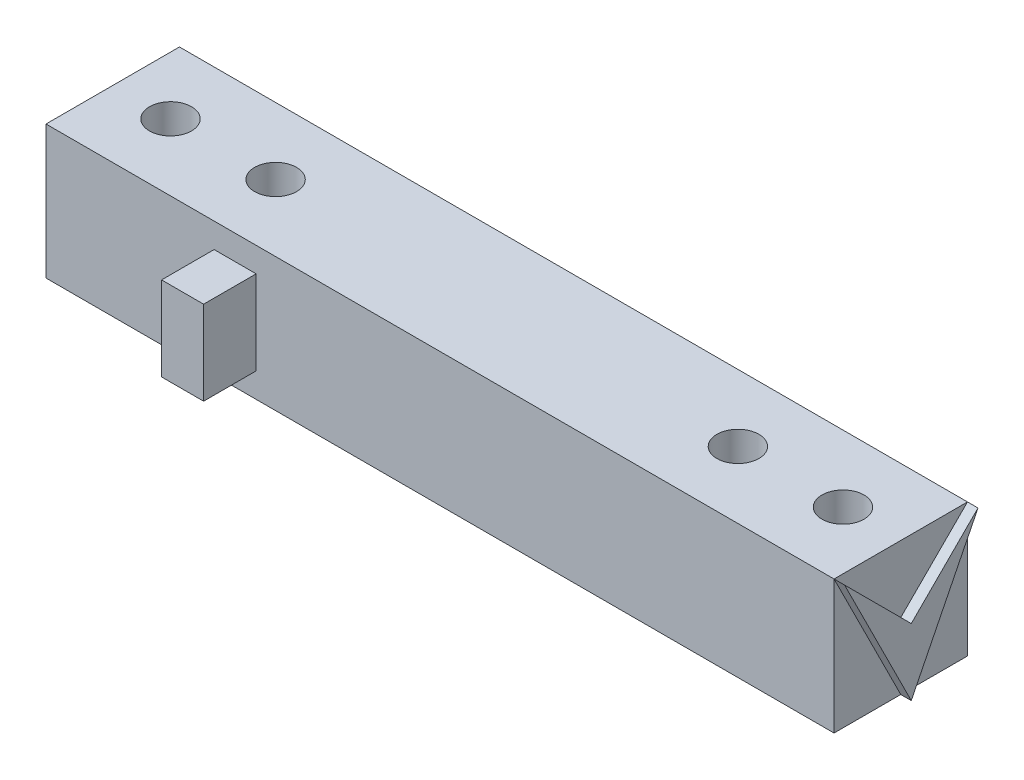
ISO-10303-21;
HEADER;
FILE_DESCRIPTION(('STEP AP214'),'2;1');
FILE_NAME('part.step','',(''),(''),'','','');
FILE_SCHEMA(('AUTOMOTIVE_DESIGN { 1 0 10303 214 1 1 1 1 }'));
ENDSEC;
DATA;
#1=APPLICATION_CONTEXT('core data for automotive mechanical design processes');
#2=APPLICATION_PROTOCOL_DEFINITION('international standard','automotive_design',2000,#1);
#3=PRODUCT_CONTEXT('',#1,'mechanical');
#4=PRODUCT('Part','Part','',(#3));
#5=PRODUCT_RELATED_PRODUCT_CATEGORY('part','',(#4));
#6=PRODUCT_DEFINITION_FORMATION('','',#4);
#7=PRODUCT_DEFINITION_CONTEXT('part definition',#1,'design');
#8=PRODUCT_DEFINITION('design','',#6,#7);
#9=PRODUCT_DEFINITION_SHAPE('','',#8);
#10=(LENGTH_UNIT() NAMED_UNIT(*) SI_UNIT(.MILLI.,.METRE.));
#11=(NAMED_UNIT(*) PLANE_ANGLE_UNIT() SI_UNIT($,.RADIAN.));
#12=(NAMED_UNIT(*) SI_UNIT($,.STERADIAN.) SOLID_ANGLE_UNIT());
#13=UNCERTAINTY_MEASURE_WITH_UNIT(LENGTH_MEASURE(1.E-05),#10,'distance_accuracy_value','');
#14=(GEOMETRIC_REPRESENTATION_CONTEXT(3) GLOBAL_UNCERTAINTY_ASSIGNED_CONTEXT((#13)) GLOBAL_UNIT_ASSIGNED_CONTEXT((#10,
#11,#12)) REPRESENTATION_CONTEXT('',''));
#15=CARTESIAN_POINT('',(0.,0.,0.));
#16=DIRECTION('',(0.,0.,1.));
#17=DIRECTION('',(1.,0.,0.));
#18=AXIS2_PLACEMENT_3D('',#15,#16,#17);
#19=CARTESIAN_POINT('',(75.,12.7,0.));
#20=DIRECTION('',(-1.,0.,0.));
#21=DIRECTION('',(0.,0.,1.));
#22=AXIS2_PLACEMENT_3D('',#19,#20,#21);
#23=PLANE('',#22);
#24=DIRECTION('',(0.,-0.894427190999916,-0.447213595499958));
#25=VECTOR('',#24,1.);
#26=CARTESIAN_POINT('',(75.,12.7,0.));
#27=LINE('',#26,#25);
#28=CARTESIAN_POINT('',(75.,12.7,0.));
#29=VERTEX_POINT('',#28);
#30=CARTESIAN_POINT('',(75.,0.,-6.35));
#31=VERTEX_POINT('',#30);
#32=EDGE_CURVE('E153',#29,#31,#27,.T.);
#33=ORIENTED_EDGE('',*,*,#32,.F.);
#34=DIRECTION('',(0.,-1.,0.));
#35=VECTOR('',#34,1.);
#36=CARTESIAN_POINT('',(75.,12.7,0.));
#37=LINE('',#36,#35);
#38=CARTESIAN_POINT('',(75.,0.,0.));
#39=VERTEX_POINT('',#38);
#40=EDGE_CURVE('E52',#29,#39,#37,.T.);
#41=ORIENTED_EDGE('',*,*,#40,.T.);
#42=DIRECTION('',(0.,0.,-1.));
#43=VECTOR('',#42,1.);
#44=CARTESIAN_POINT('',(75.,0.,0.));
#45=LINE('',#44,#43);
#46=EDGE_CURVE('E230',#39,#31,#45,.T.);
#47=ORIENTED_EDGE('',*,*,#46,.T.);
#48=EDGE_LOOP('',(#33,#41,#47));
#49=FACE_BOUND('',#48,.T.);
#50=ADVANCED_FACE('F43',(#49),#23,.F.);
#51=DIRECTION('',(0.,0.707106781186547,0.707106781186547));
#52=VECTOR('',#51,1.);
#53=CARTESIAN_POINT('',(75.,6.35,-6.35));
#54=LINE('',#53,#52);
#55=CARTESIAN_POINT('',(75.,6.35,-6.35));
#56=VERTEX_POINT('',#55);
#57=EDGE_CURVE('E60',#56,#29,#54,.T.);
#58=ORIENTED_EDGE('',*,*,#57,.F.);
#59=DIRECTION('',(0.,-0.707106781186547,0.707106781186547));
#60=VECTOR('',#59,1.);
#61=CARTESIAN_POINT('',(75.,12.7,-12.7));
#62=LINE('',#61,#60);
#63=CARTESIAN_POINT('',(75.,12.7,-12.7));
#64=VERTEX_POINT('',#63);
#65=EDGE_CURVE('E267',#64,#56,#62,.T.);
#66=ORIENTED_EDGE('',*,*,#65,.F.);
#67=DIRECTION('',(0.,0.,-1.));
#68=VECTOR('',#67,1.);
#69=CARTESIAN_POINT('',(75.,12.7,0.));
#70=LINE('',#69,#68);
#71=EDGE_CURVE('E219',#29,#64,#70,.T.);
#72=ORIENTED_EDGE('',*,*,#71,.F.);
#73=EDGE_LOOP('',(#58,#66,#72));
#74=FACE_BOUND('',#73,.T.);
#75=ADVANCED_FACE('F268',(#74),#23,.F.);
#76=DIRECTION('',(0.,0.894427190999916,-0.447213595499958));
#77=VECTOR('',#76,1.);
#78=CARTESIAN_POINT('',(75.,0.,-6.35));
#79=LINE('',#78,#77);
#80=EDGE_CURVE('E68',#31,#64,#79,.T.);
#81=ORIENTED_EDGE('',*,*,#80,.F.);
#82=CARTESIAN_POINT('',(75.,0.,-12.7));
#83=VERTEX_POINT('',#82);
#84=EDGE_CURVE('E229',#31,#83,#45,.T.);
#85=ORIENTED_EDGE('',*,*,#84,.T.);
#86=DIRECTION('',(0.,-1.,0.));
#87=VECTOR('',#86,1.);
#88=CARTESIAN_POINT('',(75.,12.7,-12.7));
#89=LINE('',#88,#87);
#90=EDGE_CURVE('E236',#64,#83,#89,.T.);
#91=ORIENTED_EDGE('',*,*,#90,.F.);
#92=EDGE_LOOP('',(#81,#85,#91));
#93=FACE_BOUND('',#92,.T.);
#94=ADVANCED_FACE('F264',(#93),#23,.F.);
#95=CARTESIAN_POINT('',(0.,12.7,0.));
#96=DIRECTION('',(0.,0.,-1.));
#97=DIRECTION('',(-1.,0.,0.));
#98=AXIS2_PLACEMENT_3D('',#95,#96,#97);
#99=PLANE('',#98);
#100=DIRECTION('',(1.,0.,0.));
#101=VECTOR('',#100,1.);
#102=CARTESIAN_POINT('',(0.,0.,0.));
#103=LINE('',#102,#101);
#104=CARTESIAN_POINT('',(0.,0.,0.));
#105=VERTEX_POINT('',#104);
#106=EDGE_CURVE('E227',#105,#39,#103,.T.);
#107=ORIENTED_EDGE('',*,*,#106,.T.);
#108=ORIENTED_EDGE('',*,*,#40,.F.);
#109=DIRECTION('',(1.,0.,0.));
#110=VECTOR('',#109,1.);
#111=CARTESIAN_POINT('',(0.,12.7,0.));
#112=LINE('',#111,#110);
#113=CARTESIAN_POINT('',(0.,12.7,0.));
#114=VERTEX_POINT('',#113);
#115=EDGE_CURVE('E215',#114,#29,#112,.T.);
#116=ORIENTED_EDGE('',*,*,#115,.F.);
#117=DIRECTION('',(0.,-1.,0.));
#118=VECTOR('',#117,1.);
#119=CARTESIAN_POINT('',(0.,12.7,0.));
#120=LINE('',#119,#118);
#121=EDGE_CURVE('E11',#114,#105,#120,.T.);
#122=ORIENTED_EDGE('',*,*,#121,.T.);
#123=EDGE_LOOP('',(#107,#108,#116,#122));
#124=FACE_BOUND('',#123,.T.);
#125=DIRECTION('',(0.,-1.,0.));
#126=VECTOR('',#125,1.);
#127=CARTESIAN_POINT('',(16.,2.35,0.));
#128=LINE('',#127,#126);
#129=CARTESIAN_POINT('',(16.,10.35,0.));
#130=VERTEX_POINT('',#129);
#131=CARTESIAN_POINT('',(16.,2.35,0.));
#132=VERTEX_POINT('',#131);
#133=EDGE_CURVE('E154',#130,#132,#128,.T.);
#134=ORIENTED_EDGE('',*,*,#133,.F.);
#135=DIRECTION('',(-1.,0.,0.));
#136=VECTOR('',#135,1.);
#137=CARTESIAN_POINT('',(20.,10.35,0.));
#138=LINE('',#137,#136);
#139=CARTESIAN_POINT('',(20.,10.35,0.));
#140=VERTEX_POINT('',#139);
#141=EDGE_CURVE('E167',#140,#130,#138,.T.);
#142=ORIENTED_EDGE('',*,*,#141,.F.);
#143=DIRECTION('',(0.,1.,0.));
#144=VECTOR('',#143,1.);
#145=CARTESIAN_POINT('',(20.,2.35,0.));
#146=LINE('',#145,#144);
#147=CARTESIAN_POINT('',(20.,2.35,0.));
#148=VERTEX_POINT('',#147);
#149=EDGE_CURVE('E176',#148,#140,#146,.T.);
#150=ORIENTED_EDGE('',*,*,#149,.F.);
#151=DIRECTION('',(1.,0.,0.));
#152=VECTOR('',#151,1.);
#153=CARTESIAN_POINT('',(20.,2.35,0.));
#154=LINE('',#153,#152);
#155=EDGE_CURVE('E157',#132,#148,#154,.T.);
#156=ORIENTED_EDGE('',*,*,#155,.F.);
#157=EDGE_LOOP('',(#134,#142,#150,#156));
#158=FACE_BOUND('',#157,.T.);
#159=ADVANCED_FACE('F300',(#124,#158),#99,.F.);
#160=CARTESIAN_POINT('',(0.,12.7,0.));
#161=DIRECTION('',(1.,0.,0.));
#162=DIRECTION('',(0.,0.,-1.));
#163=AXIS2_PLACEMENT_3D('',#160,#161,#162);
#164=PLANE('',#163);
#165=DIRECTION('',(0.,0.,1.));
#166=VECTOR('',#165,1.);
#167=CARTESIAN_POINT('',(0.,0.,0.));
#168=LINE('',#167,#166);
#169=CARTESIAN_POINT('',(0.,0.,-12.7));
#170=VERTEX_POINT('',#169);
#171=EDGE_CURVE('E211',#170,#105,#168,.T.);
#172=ORIENTED_EDGE('',*,*,#171,.T.);
#173=ORIENTED_EDGE('',*,*,#121,.F.);
#174=DIRECTION('',(0.,0.,1.));
#175=VECTOR('',#174,1.);
#176=CARTESIAN_POINT('',(0.,12.7,0.));
#177=LINE('',#176,#175);
#178=CARTESIAN_POINT('',(0.,12.7,-12.7));
#179=VERTEX_POINT('',#178);
#180=EDGE_CURVE('E212',#179,#114,#177,.T.);
#181=ORIENTED_EDGE('',*,*,#180,.F.);
#182=DIRECTION('',(0.,-1.,0.));
#183=VECTOR('',#182,1.);
#184=CARTESIAN_POINT('',(0.,12.7,-12.7));
#185=LINE('',#184,#183);
#186=EDGE_CURVE('E224',#179,#170,#185,.T.);
#187=ORIENTED_EDGE('',*,*,#186,.T.);
#188=EDGE_LOOP('',(#172,#173,#181,#187));
#189=FACE_BOUND('',#188,.T.);
#190=ADVANCED_FACE('F45',(#189),#164,.F.);
#191=CARTESIAN_POINT('',(0.,12.7,-12.7));
#192=DIRECTION('',(0.,0.,1.));
#193=DIRECTION('',(1.,0.,0.));
#194=AXIS2_PLACEMENT_3D('',#191,#192,#193);
#195=PLANE('',#194);
#196=DIRECTION('',(-1.,0.,0.));
#197=VECTOR('',#196,1.);
#198=CARTESIAN_POINT('',(0.,0.,-12.7));
#199=LINE('',#198,#197);
#200=EDGE_CURVE('E216',#83,#170,#199,.T.);
#201=ORIENTED_EDGE('',*,*,#200,.T.);
#202=ORIENTED_EDGE('',*,*,#186,.F.);
#203=DIRECTION('',(-1.,0.,0.));
#204=VECTOR('',#203,1.);
#205=CARTESIAN_POINT('',(0.,12.7,-12.7));
#206=LINE('',#205,#204);
#207=EDGE_CURVE('E222',#64,#179,#206,.T.);
#208=ORIENTED_EDGE('',*,*,#207,.F.);
#209=ORIENTED_EDGE('',*,*,#90,.T.);
#210=EDGE_LOOP('',(#201,#202,#208,#209));
#211=FACE_BOUND('',#210,.T.);
#212=ADVANCED_FACE('F263',(#211),#195,.F.);
#213=CARTESIAN_POINT('',(0.,12.7,0.));
#214=DIRECTION('',(0.,-1.,0.));
#215=DIRECTION('',(0.,0.,-1.));
#216=AXIS2_PLACEMENT_3D('',#213,#214,#215);
#217=PLANE('',#216);
#218=CARTESIAN_POINT('',(59.5,12.7,-6.35));
#219=DIRECTION('',(0.,1.,0.));
#220=DIRECTION('',(0.,0.,1.));
#221=AXIS2_PLACEMENT_3D('',#218,#219,#220);
#222=CIRCLE('',#221,1.99999999999999);
#223=CARTESIAN_POINT('',(59.5,12.7,-4.35000000000001));
#224=VERTEX_POINT('',#223);
#225=EDGE_CURVE('E192',#224,#224,#222,.T.);
#226=ORIENTED_EDGE('',*,*,#225,.F.);
#227=EDGE_LOOP('',(#226));
#228=FACE_BOUND('',#227,.T.);
#229=CARTESIAN_POINT('',(5.5,12.7,-6.35));
#230=DIRECTION('',(0.,1.,0.));
#231=DIRECTION('',(0.,0.,1.));
#232=AXIS2_PLACEMENT_3D('',#229,#230,#231);
#233=CIRCLE('',#232,1.99999999999999);
#234=CARTESIAN_POINT('',(5.5,12.7,-4.35000000000001));
#235=VERTEX_POINT('',#234);
#236=EDGE_CURVE('E198',#235,#235,#233,.T.);
#237=ORIENTED_EDGE('',*,*,#236,.F.);
#238=EDGE_LOOP('',(#237));
#239=FACE_BOUND('',#238,.T.);
#240=CARTESIAN_POINT('',(15.5,12.7,-6.35));
#241=DIRECTION('',(0.,1.,0.));
#242=DIRECTION('',(0.,0.,1.));
#243=AXIS2_PLACEMENT_3D('',#240,#241,#242);
#244=CIRCLE('',#243,1.99999999999998);
#245=CARTESIAN_POINT('',(15.5,12.7,-4.35000000000002));
#246=VERTEX_POINT('',#245);
#247=EDGE_CURVE('E201',#246,#246,#244,.T.);
#248=ORIENTED_EDGE('',*,*,#247,.F.);
#249=EDGE_LOOP('',(#248));
#250=FACE_BOUND('',#249,.T.);
#251=CARTESIAN_POINT('',(69.5,12.7,-6.35));
#252=DIRECTION('',(0.,1.,0.));
#253=DIRECTION('',(0.,0.,1.));
#254=AXIS2_PLACEMENT_3D('',#251,#252,#253);
#255=CIRCLE('',#254,1.99999999999999);
#256=CARTESIAN_POINT('',(69.5,12.7,-4.35000000000001));
#257=VERTEX_POINT('',#256);
#258=EDGE_CURVE('E205',#257,#257,#255,.T.);
#259=ORIENTED_EDGE('',*,*,#258,.F.);
#260=EDGE_LOOP('',(#259));
#261=FACE_BOUND('',#260,.T.);
#262=ORIENTED_EDGE('',*,*,#180,.T.);
#263=ORIENTED_EDGE('',*,*,#115,.T.);
#264=ORIENTED_EDGE('',*,*,#71,.T.);
#265=ORIENTED_EDGE('',*,*,#207,.T.);
#266=EDGE_LOOP('',(#262,#263,#264,#265));
#267=FACE_BOUND('',#266,.T.);
#268=ADVANCED_FACE('F250',(#228,#239,#250,#261,#267),#217,.F.);
#269=CARTESIAN_POINT('',(0.,0.,0.));
#270=DIRECTION('',(0.,-1.,0.));
#271=DIRECTION('',(0.,0.,-1.));
#272=AXIS2_PLACEMENT_3D('',#269,#270,#271);
#273=PLANE('',#272);
#274=CARTESIAN_POINT('',(59.5,0.,-6.35));
#275=DIRECTION('',(0.,-1.,0.));
#276=DIRECTION('',(0.,0.,-1.));
#277=AXIS2_PLACEMENT_3D('',#274,#275,#276);
#278=CIRCLE('',#277,1.99999999999998);
#279=CARTESIAN_POINT('',(59.5,0.,-8.34999999999998));
#280=VERTEX_POINT('',#279);
#281=EDGE_CURVE('E195',#280,#280,#278,.T.);
#282=ORIENTED_EDGE('',*,*,#281,.F.);
#283=EDGE_LOOP('',(#282));
#284=FACE_BOUND('',#283,.T.);
#285=CARTESIAN_POINT('',(5.5,0.,-6.35));
#286=DIRECTION('',(0.,-1.,0.));
#287=DIRECTION('',(0.,0.,-1.));
#288=AXIS2_PLACEMENT_3D('',#285,#286,#287);
#289=CIRCLE('',#288,1.99999999999998);
#290=CARTESIAN_POINT('',(5.5,0.,-8.34999999999998));
#291=VERTEX_POINT('',#290);
#292=EDGE_CURVE('E47',#291,#291,#289,.T.);
#293=ORIENTED_EDGE('',*,*,#292,.F.);
#294=EDGE_LOOP('',(#293));
#295=FACE_BOUND('',#294,.T.);
#296=CARTESIAN_POINT('',(15.5,0.,-6.35));
#297=DIRECTION('',(0.,-1.,0.));
#298=DIRECTION('',(0.,0.,-1.));
#299=AXIS2_PLACEMENT_3D('',#296,#297,#298);
#300=CIRCLE('',#299,1.99999999999998);
#301=CARTESIAN_POINT('',(15.5,0.,-8.34999999999998));
#302=VERTEX_POINT('',#301);
#303=EDGE_CURVE('E204',#302,#302,#300,.T.);
#304=ORIENTED_EDGE('',*,*,#303,.F.);
#305=EDGE_LOOP('',(#304));
#306=FACE_BOUND('',#305,.T.);
#307=CARTESIAN_POINT('',(69.5,0.,-6.35));
#308=DIRECTION('',(0.,-1.,0.));
#309=DIRECTION('',(0.,0.,-1.));
#310=AXIS2_PLACEMENT_3D('',#307,#308,#309);
#311=CIRCLE('',#310,1.99999999999998);
#312=CARTESIAN_POINT('',(69.5,0.,-8.34999999999998));
#313=VERTEX_POINT('',#312);
#314=EDGE_CURVE('E208',#313,#313,#311,.T.);
#315=ORIENTED_EDGE('',*,*,#314,.F.);
#316=EDGE_LOOP('',(#315));
#317=FACE_BOUND('',#316,.T.);
#318=ORIENTED_EDGE('',*,*,#171,.F.);
#319=ORIENTED_EDGE('',*,*,#200,.F.);
#320=ORIENTED_EDGE('',*,*,#84,.F.);
#321=ORIENTED_EDGE('',*,*,#46,.F.);
#322=ORIENTED_EDGE('',*,*,#106,.F.);
#323=EDGE_LOOP('',(#318,#319,#320,#321,#322));
#324=FACE_BOUND('',#323,.T.);
#325=ADVANCED_FACE('F246',(#284,#295,#306,#317,#324),#273,.T.);
#326=CARTESIAN_POINT('',(69.5,12.7,-6.35));
#327=DIRECTION('',(0.,1.,0.));
#328=DIRECTION('',(0.,0.,1.));
#329=AXIS2_PLACEMENT_3D('',#326,#327,#328);
#330=CYLINDRICAL_SURFACE('',#329,1.99999999999998);
#331=ORIENTED_EDGE('',*,*,#314,.T.);
#332=EDGE_LOOP('',(#331));
#333=FACE_BOUND('',#332,.T.);
#334=ORIENTED_EDGE('',*,*,#258,.T.);
#335=EDGE_LOOP('',(#334));
#336=FACE_BOUND('',#335,.T.);
#337=ADVANCED_FACE('F249',(#333,#336),#330,.F.);
#338=CARTESIAN_POINT('',(15.5,12.7,-6.35));
#339=DIRECTION('',(0.,1.,0.));
#340=DIRECTION('',(0.,0.,1.));
#341=AXIS2_PLACEMENT_3D('',#338,#339,#340);
#342=CYLINDRICAL_SURFACE('',#341,1.99999999999998);
#343=ORIENTED_EDGE('',*,*,#303,.T.);
#344=EDGE_LOOP('',(#343));
#345=FACE_BOUND('',#344,.T.);
#346=ORIENTED_EDGE('',*,*,#247,.T.);
#347=EDGE_LOOP('',(#346));
#348=FACE_BOUND('',#347,.T.);
#349=ADVANCED_FACE('F243',(#345,#348),#342,.F.);
#350=CARTESIAN_POINT('',(5.5,12.7,-6.35));
#351=DIRECTION('',(0.,1.,0.));
#352=DIRECTION('',(0.,0.,1.));
#353=AXIS2_PLACEMENT_3D('',#350,#351,#352);
#354=CYLINDRICAL_SURFACE('',#353,1.99999999999998);
#355=ORIENTED_EDGE('',*,*,#292,.T.);
#356=EDGE_LOOP('',(#355));
#357=FACE_BOUND('',#356,.T.);
#358=ORIENTED_EDGE('',*,*,#236,.T.);
#359=EDGE_LOOP('',(#358));
#360=FACE_BOUND('',#359,.T.);
#361=ADVANCED_FACE('F340',(#357,#360),#354,.F.);
#362=CARTESIAN_POINT('',(59.5,12.7,-6.35));
#363=DIRECTION('',(0.,1.,0.));
#364=DIRECTION('',(0.,0.,1.));
#365=AXIS2_PLACEMENT_3D('',#362,#363,#364);
#366=CYLINDRICAL_SURFACE('',#365,1.99999999999998);
#367=ORIENTED_EDGE('',*,*,#281,.T.);
#368=EDGE_LOOP('',(#367));
#369=FACE_BOUND('',#368,.T.);
#370=ORIENTED_EDGE('',*,*,#225,.T.);
#371=EDGE_LOOP('',(#370));
#372=FACE_BOUND('',#371,.T.);
#373=ADVANCED_FACE('F334',(#369,#372),#366,.F.);
#374=CARTESIAN_POINT('',(16.,2.35,5.));
#375=DIRECTION('',(1.,0.,0.));
#376=DIRECTION('',(0.,1.,0.));
#377=AXIS2_PLACEMENT_3D('',#374,#375,#376);
#378=PLANE('',#377);
#379=ORIENTED_EDGE('',*,*,#133,.T.);
#380=DIRECTION('',(0.,0.,-1.));
#381=VECTOR('',#380,1.);
#382=CARTESIAN_POINT('',(16.,2.35,5.));
#383=LINE('',#382,#381);
#384=CARTESIAN_POINT('',(16.,2.35,5.));
#385=VERTEX_POINT('',#384);
#386=EDGE_CURVE('E189',#385,#132,#383,.T.);
#387=ORIENTED_EDGE('',*,*,#386,.F.);
#388=DIRECTION('',(0.,-1.,0.));
#389=VECTOR('',#388,1.);
#390=CARTESIAN_POINT('',(16.,2.35,5.));
#391=LINE('',#390,#389);
#392=CARTESIAN_POINT('',(16.,10.35,5.));
#393=VERTEX_POINT('',#392);
#394=EDGE_CURVE('E163',#393,#385,#391,.T.);
#395=ORIENTED_EDGE('',*,*,#394,.F.);
#396=DIRECTION('',(0.,0.,-1.));
#397=VECTOR('',#396,1.);
#398=CARTESIAN_POINT('',(16.,10.35,5.));
#399=LINE('',#398,#397);
#400=EDGE_CURVE('E172',#393,#130,#399,.T.);
#401=ORIENTED_EDGE('',*,*,#400,.T.);
#402=EDGE_LOOP('',(#379,#387,#395,#401));
#403=FACE_BOUND('',#402,.T.);
#404=ADVANCED_FACE('F318',(#403),#378,.F.);
#405=CARTESIAN_POINT('',(20.,2.35,5.));
#406=DIRECTION('',(0.,1.,0.));
#407=DIRECTION('',(-1.,0.,0.));
#408=AXIS2_PLACEMENT_3D('',#405,#406,#407);
#409=PLANE('',#408);
#410=ORIENTED_EDGE('',*,*,#155,.T.);
#411=DIRECTION('',(0.,0.,-1.));
#412=VECTOR('',#411,1.);
#413=CARTESIAN_POINT('',(20.,2.35,5.));
#414=LINE('',#413,#412);
#415=CARTESIAN_POINT('',(20.,2.35,5.));
#416=VERTEX_POINT('',#415);
#417=EDGE_CURVE('E186',#416,#148,#414,.T.);
#418=ORIENTED_EDGE('',*,*,#417,.F.);
#419=DIRECTION('',(1.,0.,0.));
#420=VECTOR('',#419,1.);
#421=CARTESIAN_POINT('',(20.,2.35,5.));
#422=LINE('',#421,#420);
#423=EDGE_CURVE('E166',#385,#416,#422,.T.);
#424=ORIENTED_EDGE('',*,*,#423,.F.);
#425=ORIENTED_EDGE('',*,*,#386,.T.);
#426=EDGE_LOOP('',(#410,#418,#424,#425));
#427=FACE_BOUND('',#426,.T.);
#428=ADVANCED_FACE('F326',(#427),#409,.F.);
#429=CARTESIAN_POINT('',(20.,2.35,5.));
#430=DIRECTION('',(-1.,0.,0.));
#431=DIRECTION('',(0.,0.,1.));
#432=AXIS2_PLACEMENT_3D('',#429,#430,#431);
#433=PLANE('',#432);
#434=ORIENTED_EDGE('',*,*,#149,.T.);
#435=DIRECTION('',(0.,0.,-1.));
#436=VECTOR('',#435,1.);
#437=CARTESIAN_POINT('',(20.,10.35,5.));
#438=LINE('',#437,#436);
#439=CARTESIAN_POINT('',(20.,10.35,5.));
#440=VERTEX_POINT('',#439);
#441=EDGE_CURVE('E183',#440,#140,#438,.T.);
#442=ORIENTED_EDGE('',*,*,#441,.F.);
#443=DIRECTION('',(0.,1.,0.));
#444=VECTOR('',#443,1.);
#445=CARTESIAN_POINT('',(20.,2.35,5.));
#446=LINE('',#445,#444);
#447=EDGE_CURVE('E169',#416,#440,#446,.T.);
#448=ORIENTED_EDGE('',*,*,#447,.F.);
#449=ORIENTED_EDGE('',*,*,#417,.T.);
#450=EDGE_LOOP('',(#434,#442,#448,#449));
#451=FACE_BOUND('',#450,.T.);
#452=ADVANCED_FACE('F324',(#451),#433,.F.);
#453=CARTESIAN_POINT('',(20.,10.35,5.));
#454=DIRECTION('',(0.,-1.,0.));
#455=DIRECTION('',(1.,0.,0.));
#456=AXIS2_PLACEMENT_3D('',#453,#454,#455);
#457=PLANE('',#456);
#458=ORIENTED_EDGE('',*,*,#141,.T.);
#459=ORIENTED_EDGE('',*,*,#400,.F.);
#460=DIRECTION('',(-1.,0.,0.));
#461=VECTOR('',#460,1.);
#462=CARTESIAN_POINT('',(20.,10.35,5.));
#463=LINE('',#462,#461);
#464=EDGE_CURVE('E171',#440,#393,#463,.T.);
#465=ORIENTED_EDGE('',*,*,#464,.F.);
#466=ORIENTED_EDGE('',*,*,#441,.T.);
#467=EDGE_LOOP('',(#458,#459,#465,#466));
#468=FACE_BOUND('',#467,.T.);
#469=ADVANCED_FACE('F314',(#468),#457,.F.);
#470=CARTESIAN_POINT('',(0.,0.,5.));
#471=DIRECTION('',(0.,0.,1.));
#472=DIRECTION('',(1.,0.,0.));
#473=AXIS2_PLACEMENT_3D('',#470,#471,#472);
#474=PLANE('',#473);
#475=ORIENTED_EDGE('',*,*,#394,.T.);
#476=ORIENTED_EDGE('',*,*,#423,.T.);
#477=ORIENTED_EDGE('',*,*,#447,.T.);
#478=ORIENTED_EDGE('',*,*,#464,.T.);
#479=EDGE_LOOP('',(#475,#476,#477,#478));
#480=FACE_BOUND('',#479,.T.);
#481=ADVANCED_FACE('F320',(#480),#474,.T.);
#482=CARTESIAN_POINT('',(76.,12.7,0.));
#483=DIRECTION('',(0.,0.447213595499958,-0.894427190999916));
#484=DIRECTION('',(0.,0.894427190999916,0.447213595499958));
#485=AXIS2_PLACEMENT_3D('',#482,#483,#484);
#486=PLANE('',#485);
#487=ORIENTED_EDGE('',*,*,#32,.T.);
#488=DIRECTION('',(-1.,0.,0.));
#489=VECTOR('',#488,1.);
#490=CARTESIAN_POINT('',(76.,0.,-6.35));
#491=LINE('',#490,#489);
#492=CARTESIAN_POINT('',(76.,0.,-6.35));
#493=VERTEX_POINT('',#492);
#494=EDGE_CURVE('E135',#493,#31,#491,.T.);
#495=ORIENTED_EDGE('',*,*,#494,.F.);
#496=DIRECTION('',(0.,-0.894427190999916,-0.447213595499958));
#497=VECTOR('',#496,1.);
#498=CARTESIAN_POINT('',(76.,12.7,0.));
#499=LINE('',#498,#497);
#500=CARTESIAN_POINT('',(76.,12.7,0.));
#501=VERTEX_POINT('',#500);
#502=EDGE_CURVE('E142',#501,#493,#499,.T.);
#503=ORIENTED_EDGE('',*,*,#502,.F.);
#504=DIRECTION('',(-1.,0.,0.));
#505=VECTOR('',#504,1.);
#506=CARTESIAN_POINT('',(76.,12.7,0.));
#507=LINE('',#506,#505);
#508=EDGE_CURVE('E276',#501,#29,#507,.T.);
#509=ORIENTED_EDGE('',*,*,#508,.T.);
#510=EDGE_LOOP('',(#487,#495,#503,#509));
#511=FACE_BOUND('',#510,.T.);
#512=ADVANCED_FACE('F152',(#511),#486,.F.);
#513=CARTESIAN_POINT('',(76.,0.,-6.35));
#514=DIRECTION('',(0.,0.447213595499958,0.894427190999916));
#515=DIRECTION('',(0.,-0.894427190999916,0.447213595499958));
#516=AXIS2_PLACEMENT_3D('',#513,#514,#515);
#517=PLANE('',#516);
#518=ORIENTED_EDGE('',*,*,#80,.T.);
#519=DIRECTION('',(-1.,0.,0.));
#520=VECTOR('',#519,1.);
#521=CARTESIAN_POINT('',(76.,12.7,-12.7));
#522=LINE('',#521,#520);
#523=CARTESIAN_POINT('',(76.,12.7,-12.7));
#524=VERTEX_POINT('',#523);
#525=EDGE_CURVE('E138',#524,#64,#522,.T.);
#526=ORIENTED_EDGE('',*,*,#525,.F.);
#527=DIRECTION('',(0.,0.894427190999916,-0.447213595499958));
#528=VECTOR('',#527,1.);
#529=CARTESIAN_POINT('',(76.,0.,-6.35));
#530=LINE('',#529,#528);
#531=EDGE_CURVE('E131',#493,#524,#530,.T.);
#532=ORIENTED_EDGE('',*,*,#531,.F.);
#533=ORIENTED_EDGE('',*,*,#494,.T.);
#534=EDGE_LOOP('',(#518,#526,#532,#533));
#535=FACE_BOUND('',#534,.T.);
#536=ADVANCED_FACE('F133',(#535),#517,.F.);
#537=CARTESIAN_POINT('',(76.,12.7,-12.7));
#538=DIRECTION('',(0.,-0.707106781186547,-0.707106781186547));
#539=DIRECTION('',(0.,0.707106781186548,-0.707106781186548));
#540=AXIS2_PLACEMENT_3D('',#537,#538,#539);
#541=PLANE('',#540);
#542=ORIENTED_EDGE('',*,*,#65,.T.);
#543=DIRECTION('',(-1.,0.,0.));
#544=VECTOR('',#543,1.);
#545=CARTESIAN_POINT('',(76.,6.35,-6.35));
#546=LINE('',#545,#544);
#547=CARTESIAN_POINT('',(76.,6.35,-6.35));
#548=VERTEX_POINT('',#547);
#549=EDGE_CURVE('E159',#548,#56,#546,.T.);
#550=ORIENTED_EDGE('',*,*,#549,.F.);
#551=DIRECTION('',(0.,-0.707106781186547,0.707106781186547));
#552=VECTOR('',#551,1.);
#553=CARTESIAN_POINT('',(76.,12.7,-12.7));
#554=LINE('',#553,#552);
#555=EDGE_CURVE('E141',#524,#548,#554,.T.);
#556=ORIENTED_EDGE('',*,*,#555,.F.);
#557=ORIENTED_EDGE('',*,*,#525,.T.);
#558=EDGE_LOOP('',(#542,#550,#556,#557));
#559=FACE_BOUND('',#558,.T.);
#560=ADVANCED_FACE('F274',(#559),#541,.F.);
#561=CARTESIAN_POINT('',(76.,6.35,-6.35));
#562=DIRECTION('',(0.,-0.707106781186547,0.707106781186547));
#563=DIRECTION('',(0.,-0.707106781186548,-0.707106781186548));
#564=AXIS2_PLACEMENT_3D('',#561,#562,#563);
#565=PLANE('',#564);
#566=ORIENTED_EDGE('',*,*,#57,.T.);
#567=ORIENTED_EDGE('',*,*,#508,.F.);
#568=DIRECTION('',(0.,0.707106781186547,0.707106781186547));
#569=VECTOR('',#568,1.);
#570=CARTESIAN_POINT('',(76.,6.35,-6.35));
#571=LINE('',#570,#569);
#572=EDGE_CURVE('E147',#548,#501,#571,.T.);
#573=ORIENTED_EDGE('',*,*,#572,.F.);
#574=ORIENTED_EDGE('',*,*,#549,.T.);
#575=EDGE_LOOP('',(#566,#567,#573,#574));
#576=FACE_BOUND('',#575,.T.);
#577=ADVANCED_FACE('F282',(#576),#565,.F.);
#578=CARTESIAN_POINT('',(76.,0.,0.));
#579=DIRECTION('',(-1.,0.,0.));
#580=DIRECTION('',(0.,0.,1.));
#581=AXIS2_PLACEMENT_3D('',#578,#579,#580);
#582=PLANE('',#581);
#583=ORIENTED_EDGE('',*,*,#502,.T.);
#584=ORIENTED_EDGE('',*,*,#531,.T.);
#585=ORIENTED_EDGE('',*,*,#555,.T.);
#586=ORIENTED_EDGE('',*,*,#572,.T.);
#587=EDGE_LOOP('',(#583,#584,#585,#586));
#588=FACE_BOUND('',#587,.T.);
#589=ADVANCED_FACE('F145',(#588),#582,.F.);
#590=CLOSED_SHELL('',(#50,#75,#94,#159,#190,#212,#268,#325,#337,#349,#361,#373,#404,#428,#452,
#469,#481,#512,#536,#560,#577,#589));
#591=MANIFOLD_SOLID_BREP('B2',#590);
#592=ADVANCED_BREP_SHAPE_REPRESENTATION('',(#18,#591),#14);
#593=SHAPE_DEFINITION_REPRESENTATION(#9,#592);
ENDSEC;
END-ISO-10303-21;
